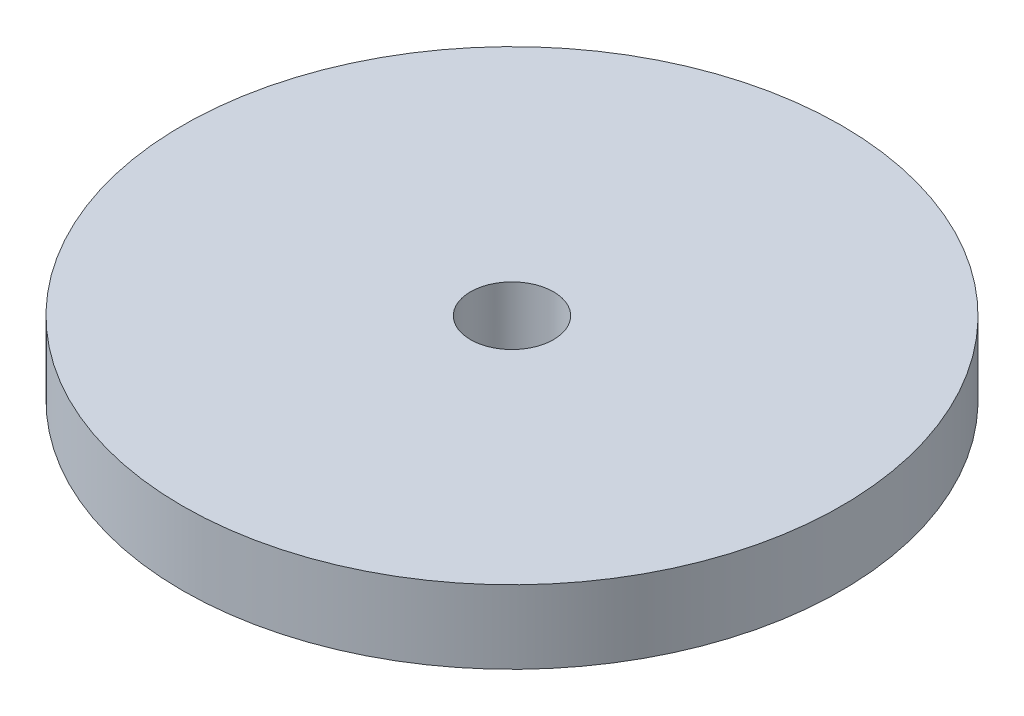
ISO-10303-21;
HEADER;
FILE_DESCRIPTION(('STEP AP214'),'2;1');
FILE_NAME('part.step','',(''),(''),'','','');
FILE_SCHEMA(('AUTOMOTIVE_DESIGN { 1 0 10303 214 1 1 1 1 }'));
ENDSEC;
DATA;
#1=APPLICATION_CONTEXT('core data for automotive mechanical design processes');
#2=APPLICATION_PROTOCOL_DEFINITION('international standard','automotive_design',2000,#1);
#3=PRODUCT_CONTEXT('',#1,'mechanical');
#4=PRODUCT('Part','Part','',(#3));
#5=PRODUCT_RELATED_PRODUCT_CATEGORY('part','',(#4));
#6=PRODUCT_DEFINITION_FORMATION('','',#4);
#7=PRODUCT_DEFINITION_CONTEXT('part definition',#1,'design');
#8=PRODUCT_DEFINITION('design','',#6,#7);
#9=PRODUCT_DEFINITION_SHAPE('','',#8);
#10=(LENGTH_UNIT() NAMED_UNIT(*) SI_UNIT(.MILLI.,.METRE.));
#11=(NAMED_UNIT(*) PLANE_ANGLE_UNIT() SI_UNIT($,.RADIAN.));
#12=(NAMED_UNIT(*) SI_UNIT($,.STERADIAN.) SOLID_ANGLE_UNIT());
#13=UNCERTAINTY_MEASURE_WITH_UNIT(LENGTH_MEASURE(1.E-05),#10,'distance_accuracy_value','');
#14=(GEOMETRIC_REPRESENTATION_CONTEXT(3) GLOBAL_UNCERTAINTY_ASSIGNED_CONTEXT((#13)) GLOBAL_UNIT_ASSIGNED_CONTEXT((#10,
#11,#12)) REPRESENTATION_CONTEXT('',''));
#15=CARTESIAN_POINT('',(0.,0.,0.));
#16=DIRECTION('',(0.,0.,1.));
#17=DIRECTION('',(1.,0.,0.));
#18=AXIS2_PLACEMENT_3D('',#15,#16,#17);
#19=CARTESIAN_POINT('',(0.,3.,0.));
#20=DIRECTION('',(0.,-1.,0.));
#21=DIRECTION('',(0.,0.,-1.));
#22=AXIS2_PLACEMENT_3D('',#19,#20,#21);
#23=CYLINDRICAL_SURFACE('',#22,13.5);
#24=CARTESIAN_POINT('',(0.,3.,0.));
#25=DIRECTION('',(0.,1.,0.));
#26=DIRECTION('',(0.,0.,1.));
#27=AXIS2_PLACEMENT_3D('',#24,#25,#26);
#28=CIRCLE('',#27,13.5);
#29=CARTESIAN_POINT('',(0.,3.,13.5));
#30=VERTEX_POINT('',#29);
#31=EDGE_CURVE('E10',#30,#30,#28,.T.);
#32=ORIENTED_EDGE('',*,*,#31,.F.);
#33=EDGE_LOOP('',(#32));
#34=FACE_BOUND('',#33,.T.);
#35=CARTESIAN_POINT('',(0.,0.,0.));
#36=DIRECTION('',(0.,1.,0.));
#37=DIRECTION('',(0.,0.,1.));
#38=AXIS2_PLACEMENT_3D('',#35,#36,#37);
#39=CIRCLE('',#38,13.5);
#40=CARTESIAN_POINT('',(0.,0.,13.5));
#41=VERTEX_POINT('',#40);
#42=EDGE_CURVE('E42',#41,#41,#39,.T.);
#43=ORIENTED_EDGE('',*,*,#42,.T.);
#44=EDGE_LOOP('',(#43));
#45=FACE_BOUND('',#44,.T.);
#46=ADVANCED_FACE('F39',(#34,#45),#23,.T.);
#47=CARTESIAN_POINT('',(0.,3.,0.));
#48=DIRECTION('',(0.,1.,0.));
#49=DIRECTION('',(0.,0.,1.));
#50=AXIS2_PLACEMENT_3D('',#47,#48,#49);
#51=PLANE('',#50);
#52=CARTESIAN_POINT('',(0.,3.,0.));
#53=DIRECTION('',(0.,1.,0.));
#54=DIRECTION('',(0.,0.,1.));
#55=AXIS2_PLACEMENT_3D('',#52,#53,#54);
#56=CIRCLE('',#55,1.69999999999997);
#57=CARTESIAN_POINT('',(0.,3.,1.69999999999997));
#58=VERTEX_POINT('',#57);
#59=EDGE_CURVE('E49',#58,#58,#56,.T.);
#60=ORIENTED_EDGE('',*,*,#59,.F.);
#61=EDGE_LOOP('',(#60));
#62=FACE_BOUND('',#61,.T.);
#63=ORIENTED_EDGE('',*,*,#31,.T.);
#64=EDGE_LOOP('',(#63));
#65=FACE_BOUND('',#64,.T.);
#66=ADVANCED_FACE('F66',(#62,#65),#51,.T.);
#67=CARTESIAN_POINT('',(0.,0.,0.));
#68=DIRECTION('',(0.,1.,0.));
#69=DIRECTION('',(0.,0.,1.));
#70=AXIS2_PLACEMENT_3D('',#67,#68,#69);
#71=PLANE('',#70);
#72=CARTESIAN_POINT('',(0.,0.,0.));
#73=DIRECTION('',(0.,-1.,0.));
#74=DIRECTION('',(0.,0.,-1.));
#75=AXIS2_PLACEMENT_3D('',#72,#73,#74);
#76=CIRCLE('',#75,1.725);
#77=CARTESIAN_POINT('',(0.,0.,-1.725));
#78=VERTEX_POINT('',#77);
#79=EDGE_CURVE('E56',#78,#78,#76,.T.);
#80=ORIENTED_EDGE('',*,*,#79,.F.);
#81=EDGE_LOOP('',(#80));
#82=FACE_BOUND('',#81,.T.);
#83=ORIENTED_EDGE('',*,*,#42,.F.);
#84=EDGE_LOOP('',(#83));
#85=FACE_BOUND('',#84,.T.);
#86=ADVANCED_FACE('F62',(#82,#85),#71,.F.);
#87=CARTESIAN_POINT('',(0.,0.,0.));
#88=DIRECTION('',(0.,-1.,0.));
#89=DIRECTION('',(0.,0.,-1.));
#90=AXIS2_PLACEMENT_3D('',#87,#88,#89);
#91=CYLINDRICAL_SURFACE('',#90,1.69999999999997);
#92=CARTESIAN_POINT('',(0.,0.0250000000000528,0.));
#93=DIRECTION('',(0.,-1.,0.));
#94=DIRECTION('',(0.,0.,-1.));
#95=AXIS2_PLACEMENT_3D('',#92,#93,#94);
#96=CIRCLE('',#95,1.69999999999994);
#97=CARTESIAN_POINT('',(0.,0.0250000000000528,-1.69999999999994));
#98=VERTEX_POINT('',#97);
#99=EDGE_CURVE('E53',#98,#98,#96,.T.);
#100=ORIENTED_EDGE('',*,*,#99,.T.);
#101=EDGE_LOOP('',(#100));
#102=FACE_BOUND('',#101,.T.);
#103=ORIENTED_EDGE('',*,*,#59,.T.);
#104=EDGE_LOOP('',(#103));
#105=FACE_BOUND('',#104,.T.);
#106=ADVANCED_FACE('F65',(#102,#105),#91,.F.);
#107=CARTESIAN_POINT('',(0.,0.,0.));
#108=DIRECTION('',(0.,-1.,0.));
#109=DIRECTION('',(0.,0.,-1.));
#110=AXIS2_PLACEMENT_3D('',#107,#108,#109);
#111=CONICAL_SURFACE('',#110,1.725,0.78539816339763);
#112=ORIENTED_EDGE('',*,*,#99,.F.);
#113=EDGE_LOOP('',(#112));
#114=FACE_BOUND('',#113,.T.);
#115=ORIENTED_EDGE('',*,*,#79,.T.);
#116=EDGE_LOOP('',(#115));
#117=FACE_BOUND('',#116,.T.);
#118=ADVANCED_FACE('F60',(#114,#117),#111,.F.);
#119=CLOSED_SHELL('',(#46,#66,#86,#106,#118));
#120=MANIFOLD_SOLID_BREP('B2',#119);
#121=ADVANCED_BREP_SHAPE_REPRESENTATION('',(#18,#120),#14);
#122=SHAPE_DEFINITION_REPRESENTATION(#9,#121);
ENDSEC;
END-ISO-10303-21;
